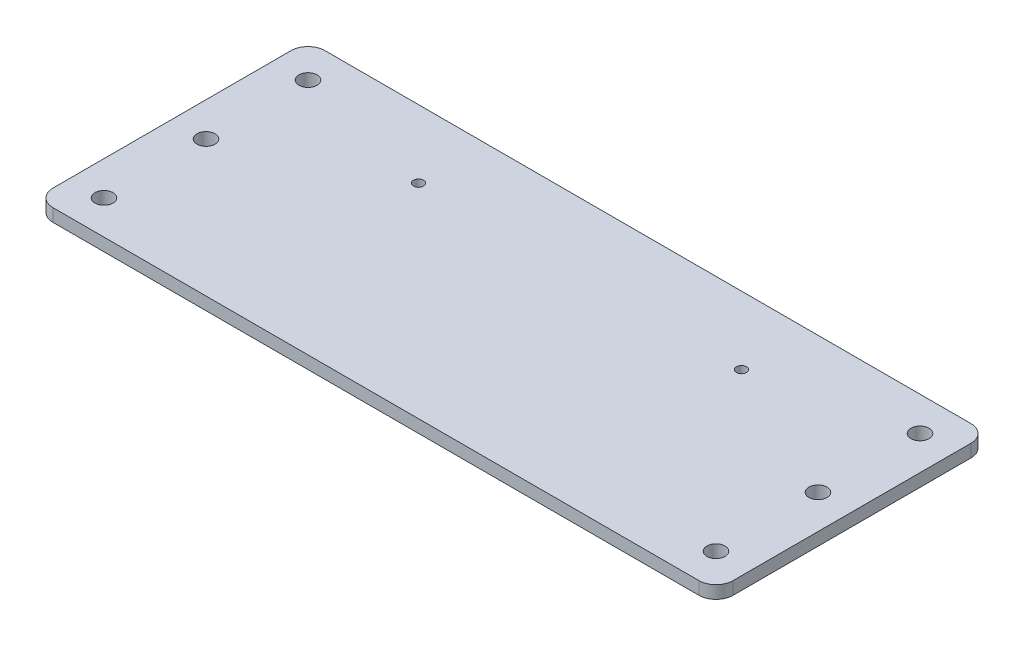
ISO-10303-21;
HEADER;
FILE_DESCRIPTION(('STEP AP214'),'2;1');
FILE_NAME('part.step','',(''),(''),'','','');
FILE_SCHEMA(('AUTOMOTIVE_DESIGN { 1 0 10303 214 1 1 1 1 }'));
ENDSEC;
DATA;
#1=APPLICATION_CONTEXT('core data for automotive mechanical design processes');
#2=APPLICATION_PROTOCOL_DEFINITION('international standard','automotive_design',2000,#1);
#3=PRODUCT_CONTEXT('',#1,'mechanical');
#4=PRODUCT('Part','Part','',(#3));
#5=PRODUCT_RELATED_PRODUCT_CATEGORY('part','',(#4));
#6=PRODUCT_DEFINITION_FORMATION('','',#4);
#7=PRODUCT_DEFINITION_CONTEXT('part definition',#1,'design');
#8=PRODUCT_DEFINITION('design','',#6,#7);
#9=PRODUCT_DEFINITION_SHAPE('','',#8);
#10=(LENGTH_UNIT() NAMED_UNIT(*) SI_UNIT(.MILLI.,.METRE.));
#11=(NAMED_UNIT(*) PLANE_ANGLE_UNIT() SI_UNIT($,.RADIAN.));
#12=(NAMED_UNIT(*) SI_UNIT($,.STERADIAN.) SOLID_ANGLE_UNIT());
#13=UNCERTAINTY_MEASURE_WITH_UNIT(LENGTH_MEASURE(1.E-05),#10,'distance_accuracy_value','');
#14=(GEOMETRIC_REPRESENTATION_CONTEXT(3) GLOBAL_UNCERTAINTY_ASSIGNED_CONTEXT((#13)) GLOBAL_UNIT_ASSIGNED_CONTEXT((#10,
#11,#12)) REPRESENTATION_CONTEXT('',''));
#15=CARTESIAN_POINT('',(0.,0.,0.));
#16=DIRECTION('',(0.,0.,1.));
#17=DIRECTION('',(1.,0.,0.));
#18=AXIS2_PLACEMENT_3D('',#15,#16,#17);
#19=CARTESIAN_POINT('',(0.,4.7625,0.));
#20=DIRECTION('',(1.,0.,0.));
#21=DIRECTION('',(0.,0.,-1.));
#22=AXIS2_PLACEMENT_3D('',#19,#20,#21);
#23=PLANE('',#22);
#24=DIRECTION('',(0.,0.,1.));
#25=VECTOR('',#24,1.);
#26=CARTESIAN_POINT('',(0.,0.,0.));
#27=LINE('',#26,#25);
#28=CARTESIAN_POINT('',(0.,0.,6.35));
#29=VERTEX_POINT('',#28);
#30=CARTESIAN_POINT('',(0.,0.,95.25));
#31=VERTEX_POINT('',#30);
#32=EDGE_CURVE('E194',#29,#31,#27,.T.);
#33=ORIENTED_EDGE('',*,*,#32,.T.);
#34=DIRECTION('',(0.,-1.,0.));
#35=VECTOR('',#34,1.);
#36=CARTESIAN_POINT('',(0.,4.7625,95.25));
#37=LINE('',#36,#35);
#38=CARTESIAN_POINT('',(0.,4.7625,95.25));
#39=VERTEX_POINT('',#38);
#40=EDGE_CURVE('E12',#31,#39,#37,.F.);
#41=ORIENTED_EDGE('',*,*,#40,.T.);
#42=DIRECTION('',(0.,0.,1.));
#43=VECTOR('',#42,1.);
#44=CARTESIAN_POINT('',(0.,4.7625,0.));
#45=LINE('',#44,#43);
#46=CARTESIAN_POINT('',(0.,4.7625,6.35));
#47=VERTEX_POINT('',#46);
#48=EDGE_CURVE('E138',#47,#39,#45,.T.);
#49=ORIENTED_EDGE('',*,*,#48,.F.);
#50=DIRECTION('',(0.,-1.,0.));
#51=VECTOR('',#50,1.);
#52=CARTESIAN_POINT('',(0.,4.7625,6.35));
#53=LINE('',#52,#51);
#54=EDGE_CURVE('E54',#47,#29,#53,.T.);
#55=ORIENTED_EDGE('',*,*,#54,.T.);
#56=EDGE_LOOP('',(#33,#41,#49,#55));
#57=FACE_BOUND('',#56,.T.);
#58=ADVANCED_FACE('F46',(#57),#23,.F.);
#59=CARTESIAN_POINT('',(0.,4.7625,101.6));
#60=DIRECTION('',(0.,0.,-1.));
#61=DIRECTION('',(-1.,0.,0.));
#62=AXIS2_PLACEMENT_3D('',#59,#60,#61);
#63=PLANE('',#62);
#64=DIRECTION('',(1.,0.,0.));
#65=VECTOR('',#64,1.);
#66=CARTESIAN_POINT('',(0.,0.,101.6));
#67=LINE('',#66,#65);
#68=CARTESIAN_POINT('',(6.35000000000001,0.,101.6));
#69=VERTEX_POINT('',#68);
#70=CARTESIAN_POINT('',(247.65,0.,101.6));
#71=VERTEX_POINT('',#70);
#72=EDGE_CURVE('E143',#69,#71,#67,.T.);
#73=ORIENTED_EDGE('',*,*,#72,.T.);
#74=DIRECTION('',(0.,-1.,0.));
#75=VECTOR('',#74,1.);
#76=CARTESIAN_POINT('',(247.65,4.7625,101.6));
#77=LINE('',#76,#75);
#78=CARTESIAN_POINT('',(247.65,4.7625,101.6));
#79=VERTEX_POINT('',#78);
#80=EDGE_CURVE('E61',#71,#79,#77,.F.);
#81=ORIENTED_EDGE('',*,*,#80,.T.);
#82=DIRECTION('',(1.,0.,0.));
#83=VECTOR('',#82,1.);
#84=CARTESIAN_POINT('',(0.,4.7625,101.6));
#85=LINE('',#84,#83);
#86=CARTESIAN_POINT('',(6.35000000000001,4.7625,101.6));
#87=VERTEX_POINT('',#86);
#88=EDGE_CURVE('E141',#87,#79,#85,.T.);
#89=ORIENTED_EDGE('',*,*,#88,.F.);
#90=DIRECTION('',(0.,-1.,0.));
#91=VECTOR('',#90,1.);
#92=CARTESIAN_POINT('',(6.35000000000001,4.7625,101.6));
#93=LINE('',#92,#91);
#94=EDGE_CURVE('E184',#87,#69,#93,.T.);
#95=ORIENTED_EDGE('',*,*,#94,.T.);
#96=EDGE_LOOP('',(#73,#81,#89,#95));
#97=FACE_BOUND('',#96,.T.);
#98=ADVANCED_FACE('F287',(#97),#63,.F.);
#99=CARTESIAN_POINT('',(254.,4.7625,0.));
#100=DIRECTION('',(-1.,0.,0.));
#101=DIRECTION('',(0.,0.,1.));
#102=AXIS2_PLACEMENT_3D('',#99,#100,#101);
#103=PLANE('',#102);
#104=DIRECTION('',(0.,0.,-1.));
#105=VECTOR('',#104,1.);
#106=CARTESIAN_POINT('',(254.,0.,0.));
#107=LINE('',#106,#105);
#108=CARTESIAN_POINT('',(254.,0.,95.25));
#109=VERTEX_POINT('',#108);
#110=CARTESIAN_POINT('',(254.,0.,6.35));
#111=VERTEX_POINT('',#110);
#112=EDGE_CURVE('E139',#109,#111,#107,.T.);
#113=ORIENTED_EDGE('',*,*,#112,.T.);
#114=DIRECTION('',(0.,-1.,0.));
#115=VECTOR('',#114,1.);
#116=CARTESIAN_POINT('',(254.,4.7625,6.35));
#117=LINE('',#116,#115);
#118=CARTESIAN_POINT('',(254.,4.7625,6.35));
#119=VERTEX_POINT('',#118);
#120=EDGE_CURVE('E117',#111,#119,#117,.F.);
#121=ORIENTED_EDGE('',*,*,#120,.T.);
#122=DIRECTION('',(0.,0.,-1.));
#123=VECTOR('',#122,1.);
#124=CARTESIAN_POINT('',(254.,4.7625,0.));
#125=LINE('',#124,#123);
#126=CARTESIAN_POINT('',(254.,4.7625,95.25));
#127=VERTEX_POINT('',#126);
#128=EDGE_CURVE('E172',#127,#119,#125,.T.);
#129=ORIENTED_EDGE('',*,*,#128,.F.);
#130=DIRECTION('',(0.,-1.,0.));
#131=VECTOR('',#130,1.);
#132=CARTESIAN_POINT('',(254.,4.7625,95.25));
#133=LINE('',#132,#131);
#134=EDGE_CURVE('E122',#127,#109,#133,.T.);
#135=ORIENTED_EDGE('',*,*,#134,.T.);
#136=EDGE_LOOP('',(#113,#121,#129,#135));
#137=FACE_BOUND('',#136,.T.);
#138=ADVANCED_FACE('F284',(#137),#103,.F.);
#139=CARTESIAN_POINT('',(0.,4.7625,0.));
#140=DIRECTION('',(0.,0.,1.));
#141=DIRECTION('',(1.,0.,0.));
#142=AXIS2_PLACEMENT_3D('',#139,#140,#141);
#143=PLANE('',#142);
#144=DIRECTION('',(-1.,0.,0.));
#145=VECTOR('',#144,1.);
#146=CARTESIAN_POINT('',(0.,4.7625,0.));
#147=LINE('',#146,#145);
#148=CARTESIAN_POINT('',(247.65,4.7625,0.));
#149=VERTEX_POINT('',#148);
#150=CARTESIAN_POINT('',(6.35,4.7625,0.));
#151=VERTEX_POINT('',#150);
#152=EDGE_CURVE('E132',#149,#151,#147,.T.);
#153=ORIENTED_EDGE('',*,*,#152,.F.);
#154=DIRECTION('',(0.,-1.,0.));
#155=VECTOR('',#154,1.);
#156=CARTESIAN_POINT('',(247.65,4.7625,0.));
#157=LINE('',#156,#155);
#158=CARTESIAN_POINT('',(247.65,0.,0.));
#159=VERTEX_POINT('',#158);
#160=EDGE_CURVE('E116',#149,#159,#157,.T.);
#161=ORIENTED_EDGE('',*,*,#160,.T.);
#162=DIRECTION('',(-1.,0.,0.));
#163=VECTOR('',#162,1.);
#164=CARTESIAN_POINT('',(0.,0.,0.));
#165=LINE('',#164,#163);
#166=CARTESIAN_POINT('',(6.35,0.,0.));
#167=VERTEX_POINT('',#166);
#168=EDGE_CURVE('E129',#159,#167,#165,.T.);
#169=ORIENTED_EDGE('',*,*,#168,.T.);
#170=DIRECTION('',(0.,-1.,0.));
#171=VECTOR('',#170,1.);
#172=CARTESIAN_POINT('',(6.35,4.7625,0.));
#173=LINE('',#172,#171);
#174=EDGE_CURVE('E134',#167,#151,#173,.F.);
#175=ORIENTED_EDGE('',*,*,#174,.T.);
#176=EDGE_LOOP('',(#153,#161,#169,#175));
#177=FACE_BOUND('',#176,.T.);
#178=ADVANCED_FACE('F128',(#177),#143,.F.);
#179=CARTESIAN_POINT('',(0.,4.7625,0.));
#180=DIRECTION('',(0.,1.,0.));
#181=DIRECTION('',(0.,0.,1.));
#182=AXIS2_PLACEMENT_3D('',#179,#180,#181);
#183=PLANE('',#182);
#184=CARTESIAN_POINT('',(12.7,4.7625,12.7));
#185=DIRECTION('',(0.,1.,0.));
#186=DIRECTION('',(0.,0.,1.));
#187=AXIS2_PLACEMENT_3D('',#184,#185,#186);
#188=CIRCLE('',#187,3.3782);
#189=CARTESIAN_POINT('',(12.7,4.7625,16.0782));
#190=VERTEX_POINT('',#189);
#191=EDGE_CURVE('E257',#190,#190,#188,.T.);
#192=ORIENTED_EDGE('',*,*,#191,.F.);
#193=EDGE_LOOP('',(#192));
#194=FACE_BOUND('',#193,.T.);
#195=CARTESIAN_POINT('',(12.7,4.7625,88.9));
#196=DIRECTION('',(0.,1.,0.));
#197=DIRECTION('',(0.,0.,1.));
#198=AXIS2_PLACEMENT_3D('',#195,#196,#197);
#199=CIRCLE('',#198,3.3782);
#200=CARTESIAN_POINT('',(12.7,4.7625,92.2782));
#201=VERTEX_POINT('',#200);
#202=EDGE_CURVE('E250',#201,#201,#199,.T.);
#203=ORIENTED_EDGE('',*,*,#202,.F.);
#204=EDGE_LOOP('',(#203));
#205=FACE_BOUND('',#204,.T.);
#206=CARTESIAN_POINT('',(241.3,4.7625,88.9));
#207=DIRECTION('',(0.,1.,0.));
#208=DIRECTION('',(0.,0.,1.));
#209=AXIS2_PLACEMENT_3D('',#206,#207,#208);
#210=CIRCLE('',#209,3.3782);
#211=CARTESIAN_POINT('',(241.3,4.7625,92.2782));
#212=VERTEX_POINT('',#211);
#213=EDGE_CURVE('E244',#212,#212,#210,.T.);
#214=ORIENTED_EDGE('',*,*,#213,.F.);
#215=EDGE_LOOP('',(#214));
#216=FACE_BOUND('',#215,.T.);
#217=CARTESIAN_POINT('',(241.3,4.7625,12.7));
#218=DIRECTION('',(0.,1.,0.));
#219=DIRECTION('',(0.,0.,1.));
#220=AXIS2_PLACEMENT_3D('',#217,#218,#219);
#221=CIRCLE('',#220,3.3782);
#222=CARTESIAN_POINT('',(241.3,4.7625,16.0782));
#223=VERTEX_POINT('',#222);
#224=EDGE_CURVE('E234',#223,#223,#221,.T.);
#225=ORIENTED_EDGE('',*,*,#224,.F.);
#226=EDGE_LOOP('',(#225));
#227=FACE_BOUND('',#226,.T.);
#228=CARTESIAN_POINT('',(12.7,4.7625,50.8));
#229=DIRECTION('',(0.,1.,0.));
#230=DIRECTION('',(0.,0.,1.));
#231=AXIS2_PLACEMENT_3D('',#228,#229,#230);
#232=CIRCLE('',#231,3.3782);
#233=CARTESIAN_POINT('',(12.7,4.7625,54.1782));
#234=VERTEX_POINT('',#233);
#235=EDGE_CURVE('E227',#234,#234,#232,.T.);
#236=ORIENTED_EDGE('',*,*,#235,.F.);
#237=EDGE_LOOP('',(#236));
#238=FACE_BOUND('',#237,.T.);
#239=CARTESIAN_POINT('',(241.3,4.7625,50.8));
#240=DIRECTION('',(0.,1.,0.));
#241=DIRECTION('',(0.,0.,1.));
#242=AXIS2_PLACEMENT_3D('',#239,#240,#241);
#243=CIRCLE('',#242,3.3782);
#244=CARTESIAN_POINT('',(241.3,4.7625,54.1782));
#245=VERTEX_POINT('',#244);
#246=EDGE_CURVE('E221',#245,#245,#243,.T.);
#247=ORIENTED_EDGE('',*,*,#246,.F.);
#248=EDGE_LOOP('',(#247));
#249=FACE_BOUND('',#248,.T.);
#250=CARTESIAN_POINT('',(66.675,4.7625,25.4));
#251=DIRECTION('',(0.,1.,0.));
#252=DIRECTION('',(0.,0.,1.));
#253=AXIS2_PLACEMENT_3D('',#250,#251,#252);
#254=CIRCLE('',#253,1.89865);
#255=CARTESIAN_POINT('',(66.675,4.7625,27.29865));
#256=VERTEX_POINT('',#255);
#257=EDGE_CURVE('E208',#256,#256,#254,.T.);
#258=ORIENTED_EDGE('',*,*,#257,.F.);
#259=EDGE_LOOP('',(#258));
#260=FACE_BOUND('',#259,.T.);
#261=CARTESIAN_POINT('',(187.325,4.7625,25.4));
#262=DIRECTION('',(0.,1.,0.));
#263=DIRECTION('',(0.,0.,1.));
#264=AXIS2_PLACEMENT_3D('',#261,#262,#263);
#265=CIRCLE('',#264,1.89865);
#266=CARTESIAN_POINT('',(187.325,4.7625,27.29865));
#267=VERTEX_POINT('',#266);
#268=EDGE_CURVE('E200',#267,#267,#265,.T.);
#269=ORIENTED_EDGE('',*,*,#268,.F.);
#270=EDGE_LOOP('',(#269));
#271=FACE_BOUND('',#270,.T.);
#272=ORIENTED_EDGE('',*,*,#128,.T.);
#273=CARTESIAN_POINT('',(247.65,4.7625,6.35));
#274=DIRECTION('',(0.,1.,0.));
#275=DIRECTION('',(0.,0.,1.));
#276=AXIS2_PLACEMENT_3D('',#273,#274,#275);
#277=CIRCLE('',#276,6.35);
#278=EDGE_CURVE('E181',#119,#149,#277,.T.);
#279=ORIENTED_EDGE('',*,*,#278,.T.);
#280=ORIENTED_EDGE('',*,*,#152,.T.);
#281=CARTESIAN_POINT('',(6.35,4.7625,6.35));
#282=DIRECTION('',(0.,1.,0.));
#283=DIRECTION('',(0.,0.,1.));
#284=AXIS2_PLACEMENT_3D('',#281,#282,#283);
#285=CIRCLE('',#284,6.35);
#286=EDGE_CURVE('E155',#151,#47,#285,.T.);
#287=ORIENTED_EDGE('',*,*,#286,.T.);
#288=ORIENTED_EDGE('',*,*,#48,.T.);
#289=CARTESIAN_POINT('',(6.35000000000001,4.7625,95.25));
#290=DIRECTION('',(0.,1.,0.));
#291=DIRECTION('',(0.,0.,1.));
#292=AXIS2_PLACEMENT_3D('',#289,#290,#291);
#293=CIRCLE('',#292,6.35);
#294=EDGE_CURVE('E68',#39,#87,#293,.T.);
#295=ORIENTED_EDGE('',*,*,#294,.T.);
#296=ORIENTED_EDGE('',*,*,#88,.T.);
#297=CARTESIAN_POINT('',(247.65,4.7625,95.25));
#298=DIRECTION('',(0.,1.,0.));
#299=DIRECTION('',(0.,0.,1.));
#300=AXIS2_PLACEMENT_3D('',#297,#298,#299);
#301=CIRCLE('',#300,6.35);
#302=EDGE_CURVE('E185',#79,#127,#301,.T.);
#303=ORIENTED_EDGE('',*,*,#302,.T.);
#304=EDGE_LOOP('',(#272,#279,#280,#287,#288,#295,#296,#303));
#305=FACE_BOUND('',#304,.T.);
#306=ADVANCED_FACE('F264',(#194,#205,#216,#227,#238,#249,#260,#271,#305),#183,.T.);
#307=CARTESIAN_POINT('',(0.,0.,0.));
#308=DIRECTION('',(0.,1.,0.));
#309=DIRECTION('',(0.,0.,1.));
#310=AXIS2_PLACEMENT_3D('',#307,#308,#309);
#311=PLANE('',#310);
#312=CARTESIAN_POINT('',(12.7,0.,12.7));
#313=DIRECTION('',(0.,1.,0.));
#314=DIRECTION('',(0.,0.,1.));
#315=AXIS2_PLACEMENT_3D('',#312,#313,#314);
#316=CIRCLE('',#315,3.3782);
#317=CARTESIAN_POINT('',(12.7,0.,16.0782));
#318=VERTEX_POINT('',#317);
#319=EDGE_CURVE('E254',#318,#318,#316,.T.);
#320=ORIENTED_EDGE('',*,*,#319,.T.);
#321=EDGE_LOOP('',(#320));
#322=FACE_BOUND('',#321,.T.);
#323=CARTESIAN_POINT('',(12.7,0.,88.9));
#324=DIRECTION('',(0.,1.,0.));
#325=DIRECTION('',(0.,0.,1.));
#326=AXIS2_PLACEMENT_3D('',#323,#324,#325);
#327=CIRCLE('',#326,3.3782);
#328=CARTESIAN_POINT('',(12.7,0.,92.2782));
#329=VERTEX_POINT('',#328);
#330=EDGE_CURVE('E248',#329,#329,#327,.T.);
#331=ORIENTED_EDGE('',*,*,#330,.T.);
#332=EDGE_LOOP('',(#331));
#333=FACE_BOUND('',#332,.T.);
#334=CARTESIAN_POINT('',(241.3,0.,88.9));
#335=DIRECTION('',(0.,1.,0.));
#336=DIRECTION('',(0.,0.,1.));
#337=AXIS2_PLACEMENT_3D('',#334,#335,#336);
#338=CIRCLE('',#337,3.3782);
#339=CARTESIAN_POINT('',(241.3,0.,92.2782));
#340=VERTEX_POINT('',#339);
#341=EDGE_CURVE('E238',#340,#340,#338,.T.);
#342=ORIENTED_EDGE('',*,*,#341,.T.);
#343=EDGE_LOOP('',(#342));
#344=FACE_BOUND('',#343,.T.);
#345=CARTESIAN_POINT('',(241.3,0.,12.7));
#346=DIRECTION('',(0.,1.,0.));
#347=DIRECTION('',(0.,0.,1.));
#348=AXIS2_PLACEMENT_3D('',#345,#346,#347);
#349=CIRCLE('',#348,3.3782);
#350=CARTESIAN_POINT('',(241.3,0.,16.0782));
#351=VERTEX_POINT('',#350);
#352=EDGE_CURVE('E231',#351,#351,#349,.T.);
#353=ORIENTED_EDGE('',*,*,#352,.T.);
#354=EDGE_LOOP('',(#353));
#355=FACE_BOUND('',#354,.T.);
#356=CARTESIAN_POINT('',(12.7,0.,50.8));
#357=DIRECTION('',(0.,1.,0.));
#358=DIRECTION('',(0.,0.,1.));
#359=AXIS2_PLACEMENT_3D('',#356,#357,#358);
#360=CIRCLE('',#359,3.3782);
#361=CARTESIAN_POINT('',(12.7,0.,54.1782));
#362=VERTEX_POINT('',#361);
#363=EDGE_CURVE('E225',#362,#362,#360,.T.);
#364=ORIENTED_EDGE('',*,*,#363,.T.);
#365=EDGE_LOOP('',(#364));
#366=FACE_BOUND('',#365,.T.);
#367=CARTESIAN_POINT('',(241.3,0.,50.8));
#368=DIRECTION('',(0.,1.,0.));
#369=DIRECTION('',(0.,0.,1.));
#370=AXIS2_PLACEMENT_3D('',#367,#368,#369);
#371=CIRCLE('',#370,3.3782);
#372=CARTESIAN_POINT('',(241.3,0.,54.1782));
#373=VERTEX_POINT('',#372);
#374=EDGE_CURVE('E215',#373,#373,#371,.T.);
#375=ORIENTED_EDGE('',*,*,#374,.T.);
#376=EDGE_LOOP('',(#375));
#377=FACE_BOUND('',#376,.T.);
#378=CARTESIAN_POINT('',(66.675,0.,25.4));
#379=DIRECTION('',(0.,1.,0.));
#380=DIRECTION('',(0.,0.,1.));
#381=AXIS2_PLACEMENT_3D('',#378,#379,#380);
#382=CIRCLE('',#381,1.89865);
#383=CARTESIAN_POINT('',(66.675,0.,27.29865));
#384=VERTEX_POINT('',#383);
#385=EDGE_CURVE('E204',#384,#384,#382,.T.);
#386=ORIENTED_EDGE('',*,*,#385,.T.);
#387=EDGE_LOOP('',(#386));
#388=FACE_BOUND('',#387,.T.);
#389=CARTESIAN_POINT('',(187.325,0.,25.4));
#390=DIRECTION('',(0.,1.,0.));
#391=DIRECTION('',(0.,0.,1.));
#392=AXIS2_PLACEMENT_3D('',#389,#390,#391);
#393=CIRCLE('',#392,1.89865);
#394=CARTESIAN_POINT('',(187.325,0.,27.29865));
#395=VERTEX_POINT('',#394);
#396=EDGE_CURVE('E168',#395,#395,#393,.T.);
#397=ORIENTED_EDGE('',*,*,#396,.T.);
#398=EDGE_LOOP('',(#397));
#399=FACE_BOUND('',#398,.T.);
#400=ORIENTED_EDGE('',*,*,#168,.F.);
#401=CARTESIAN_POINT('',(247.65,0.,6.35));
#402=DIRECTION('',(0.,1.,0.));
#403=DIRECTION('',(0.,0.,1.));
#404=AXIS2_PLACEMENT_3D('',#401,#402,#403);
#405=CIRCLE('',#404,6.35);
#406=EDGE_CURVE('E112',#159,#111,#405,.F.);
#407=ORIENTED_EDGE('',*,*,#406,.T.);
#408=ORIENTED_EDGE('',*,*,#112,.F.);
#409=CARTESIAN_POINT('',(247.65,0.,95.25));
#410=DIRECTION('',(0.,1.,0.));
#411=DIRECTION('',(0.,0.,1.));
#412=AXIS2_PLACEMENT_3D('',#409,#410,#411);
#413=CIRCLE('',#412,6.35);
#414=EDGE_CURVE('E123',#109,#71,#413,.F.);
#415=ORIENTED_EDGE('',*,*,#414,.T.);
#416=ORIENTED_EDGE('',*,*,#72,.F.);
#417=CARTESIAN_POINT('',(6.35000000000001,0.,95.25));
#418=DIRECTION('',(0.,1.,0.));
#419=DIRECTION('',(0.,0.,1.));
#420=AXIS2_PLACEMENT_3D('',#417,#418,#419);
#421=CIRCLE('',#420,6.35);
#422=EDGE_CURVE('E149',#69,#31,#421,.F.);
#423=ORIENTED_EDGE('',*,*,#422,.T.);
#424=ORIENTED_EDGE('',*,*,#32,.F.);
#425=CARTESIAN_POINT('',(6.35,0.,6.35));
#426=DIRECTION('',(0.,1.,0.));
#427=DIRECTION('',(0.,0.,1.));
#428=AXIS2_PLACEMENT_3D('',#425,#426,#427);
#429=CIRCLE('',#428,6.35);
#430=EDGE_CURVE('E133',#29,#167,#429,.F.);
#431=ORIENTED_EDGE('',*,*,#430,.T.);
#432=EDGE_LOOP('',(#400,#407,#408,#415,#416,#423,#424,#431));
#433=FACE_BOUND('',#432,.T.);
#434=ADVANCED_FACE('F136',(#322,#333,#344,#355,#366,#377,#388,#399,#433),#311,.F.);
#435=CARTESIAN_POINT('',(247.65,4.7625,6.35));
#436=DIRECTION('',(0.,-1.,0.));
#437=DIRECTION('',(0.,0.,-1.));
#438=AXIS2_PLACEMENT_3D('',#435,#436,#437);
#439=CYLINDRICAL_SURFACE('',#438,6.35);
#440=ORIENTED_EDGE('',*,*,#278,.F.);
#441=ORIENTED_EDGE('',*,*,#120,.F.);
#442=ORIENTED_EDGE('',*,*,#406,.F.);
#443=ORIENTED_EDGE('',*,*,#160,.F.);
#444=EDGE_LOOP('',(#440,#441,#442,#443));
#445=FACE_BOUND('',#444,.T.);
#446=ADVANCED_FACE('F115',(#445),#439,.T.);
#447=CARTESIAN_POINT('',(247.65,4.7625,95.25));
#448=DIRECTION('',(0.,-1.,0.));
#449=DIRECTION('',(0.,0.,-1.));
#450=AXIS2_PLACEMENT_3D('',#447,#448,#449);
#451=CYLINDRICAL_SURFACE('',#450,6.35);
#452=ORIENTED_EDGE('',*,*,#302,.F.);
#453=ORIENTED_EDGE('',*,*,#80,.F.);
#454=ORIENTED_EDGE('',*,*,#414,.F.);
#455=ORIENTED_EDGE('',*,*,#134,.F.);
#456=EDGE_LOOP('',(#452,#453,#454,#455));
#457=FACE_BOUND('',#456,.T.);
#458=ADVANCED_FACE('F286',(#457),#451,.T.);
#459=CARTESIAN_POINT('',(6.35000000000001,4.7625,95.25));
#460=DIRECTION('',(0.,-1.,0.));
#461=DIRECTION('',(0.,0.,-1.));
#462=AXIS2_PLACEMENT_3D('',#459,#460,#461);
#463=CYLINDRICAL_SURFACE('',#462,6.35);
#464=ORIENTED_EDGE('',*,*,#294,.F.);
#465=ORIENTED_EDGE('',*,*,#40,.F.);
#466=ORIENTED_EDGE('',*,*,#422,.F.);
#467=ORIENTED_EDGE('',*,*,#94,.F.);
#468=EDGE_LOOP('',(#464,#465,#466,#467));
#469=FACE_BOUND('',#468,.T.);
#470=ADVANCED_FACE('F290',(#469),#463,.T.);
#471=CARTESIAN_POINT('',(6.35,4.7625,6.35));
#472=DIRECTION('',(0.,-1.,0.));
#473=DIRECTION('',(0.,0.,-1.));
#474=AXIS2_PLACEMENT_3D('',#471,#472,#473);
#475=CYLINDRICAL_SURFACE('',#474,6.35);
#476=ORIENTED_EDGE('',*,*,#286,.F.);
#477=ORIENTED_EDGE('',*,*,#174,.F.);
#478=ORIENTED_EDGE('',*,*,#430,.F.);
#479=ORIENTED_EDGE('',*,*,#54,.F.);
#480=EDGE_LOOP('',(#476,#477,#478,#479));
#481=FACE_BOUND('',#480,.T.);
#482=ADVANCED_FACE('F48',(#481),#475,.T.);
#483=CARTESIAN_POINT('',(187.325,4.7625,25.4));
#484=DIRECTION('',(0.,1.,0.));
#485=DIRECTION('',(0.,0.,1.));
#486=AXIS2_PLACEMENT_3D('',#483,#484,#485);
#487=CYLINDRICAL_SURFACE('',#486,1.89865);
#488=ORIENTED_EDGE('',*,*,#396,.F.);
#489=EDGE_LOOP('',(#488));
#490=FACE_BOUND('',#489,.T.);
#491=ORIENTED_EDGE('',*,*,#268,.T.);
#492=EDGE_LOOP('',(#491));
#493=FACE_BOUND('',#492,.T.);
#494=ADVANCED_FACE('F292',(#490,#493),#487,.F.);
#495=CARTESIAN_POINT('',(66.675,4.7625,25.4));
#496=DIRECTION('',(0.,1.,0.));
#497=DIRECTION('',(0.,0.,1.));
#498=AXIS2_PLACEMENT_3D('',#495,#496,#497);
#499=CYLINDRICAL_SURFACE('',#498,1.89865);
#500=ORIENTED_EDGE('',*,*,#385,.F.);
#501=EDGE_LOOP('',(#500));
#502=FACE_BOUND('',#501,.T.);
#503=ORIENTED_EDGE('',*,*,#257,.T.);
#504=EDGE_LOOP('',(#503));
#505=FACE_BOUND('',#504,.T.);
#506=ADVANCED_FACE('F297',(#502,#505),#499,.F.);
#507=CARTESIAN_POINT('',(241.3,4.7625,50.8));
#508=DIRECTION('',(0.,1.,0.));
#509=DIRECTION('',(0.,0.,1.));
#510=AXIS2_PLACEMENT_3D('',#507,#508,#509);
#511=CYLINDRICAL_SURFACE('',#510,3.3782);
#512=ORIENTED_EDGE('',*,*,#374,.F.);
#513=EDGE_LOOP('',(#512));
#514=FACE_BOUND('',#513,.T.);
#515=ORIENTED_EDGE('',*,*,#246,.T.);
#516=EDGE_LOOP('',(#515));
#517=FACE_BOUND('',#516,.T.);
#518=ADVANCED_FACE('F342',(#514,#517),#511,.F.);
#519=CARTESIAN_POINT('',(12.7,4.7625,50.8));
#520=DIRECTION('',(0.,1.,0.));
#521=DIRECTION('',(0.,0.,1.));
#522=AXIS2_PLACEMENT_3D('',#519,#520,#521);
#523=CYLINDRICAL_SURFACE('',#522,3.3782);
#524=ORIENTED_EDGE('',*,*,#363,.F.);
#525=EDGE_LOOP('',(#524));
#526=FACE_BOUND('',#525,.T.);
#527=ORIENTED_EDGE('',*,*,#235,.T.);
#528=EDGE_LOOP('',(#527));
#529=FACE_BOUND('',#528,.T.);
#530=ADVANCED_FACE('F372',(#526,#529),#523,.F.);
#531=CARTESIAN_POINT('',(241.3,4.7625,12.7));
#532=DIRECTION('',(0.,1.,0.));
#533=DIRECTION('',(0.,0.,1.));
#534=AXIS2_PLACEMENT_3D('',#531,#532,#533);
#535=CYLINDRICAL_SURFACE('',#534,3.3782);
#536=ORIENTED_EDGE('',*,*,#352,.F.);
#537=EDGE_LOOP('',(#536));
#538=FACE_BOUND('',#537,.T.);
#539=ORIENTED_EDGE('',*,*,#224,.T.);
#540=EDGE_LOOP('',(#539));
#541=FACE_BOUND('',#540,.T.);
#542=ADVANCED_FACE('F383',(#538,#541),#535,.F.);
#543=CARTESIAN_POINT('',(241.3,4.7625,88.9));
#544=DIRECTION('',(0.,1.,0.));
#545=DIRECTION('',(0.,0.,1.));
#546=AXIS2_PLACEMENT_3D('',#543,#544,#545);
#547=CYLINDRICAL_SURFACE('',#546,3.3782);
#548=ORIENTED_EDGE('',*,*,#341,.F.);
#549=EDGE_LOOP('',(#548));
#550=FACE_BOUND('',#549,.T.);
#551=ORIENTED_EDGE('',*,*,#213,.T.);
#552=EDGE_LOOP('',(#551));
#553=FACE_BOUND('',#552,.T.);
#554=ADVANCED_FACE('F394',(#550,#553),#547,.F.);
#555=CARTESIAN_POINT('',(12.7,4.7625,88.9));
#556=DIRECTION('',(0.,1.,0.));
#557=DIRECTION('',(0.,0.,1.));
#558=AXIS2_PLACEMENT_3D('',#555,#556,#557);
#559=CYLINDRICAL_SURFACE('',#558,3.3782);
#560=ORIENTED_EDGE('',*,*,#330,.F.);
#561=EDGE_LOOP('',(#560));
#562=FACE_BOUND('',#561,.T.);
#563=ORIENTED_EDGE('',*,*,#202,.T.);
#564=EDGE_LOOP('',(#563));
#565=FACE_BOUND('',#564,.T.);
#566=ADVANCED_FACE('F405',(#562,#565),#559,.F.);
#567=CARTESIAN_POINT('',(12.7,4.7625,12.7));
#568=DIRECTION('',(0.,1.,0.));
#569=DIRECTION('',(0.,0.,1.));
#570=AXIS2_PLACEMENT_3D('',#567,#568,#569);
#571=CYLINDRICAL_SURFACE('',#570,3.3782);
#572=ORIENTED_EDGE('',*,*,#319,.F.);
#573=EDGE_LOOP('',(#572));
#574=FACE_BOUND('',#573,.T.);
#575=ORIENTED_EDGE('',*,*,#191,.T.);
#576=EDGE_LOOP('',(#575));
#577=FACE_BOUND('',#576,.T.);
#578=ADVANCED_FACE('F262',(#574,#577),#571,.F.);
#579=CLOSED_SHELL('',(#58,#98,#138,#178,#306,#434,#446,#458,#470,#482,#494,#506,#518,#530,#542,
#554,#566,#578));
#580=MANIFOLD_SOLID_BREP('B2',#579);
#581=ADVANCED_BREP_SHAPE_REPRESENTATION('',(#18,#580),#14);
#582=SHAPE_DEFINITION_REPRESENTATION(#9,#581);
ENDSEC;
END-ISO-10303-21;
